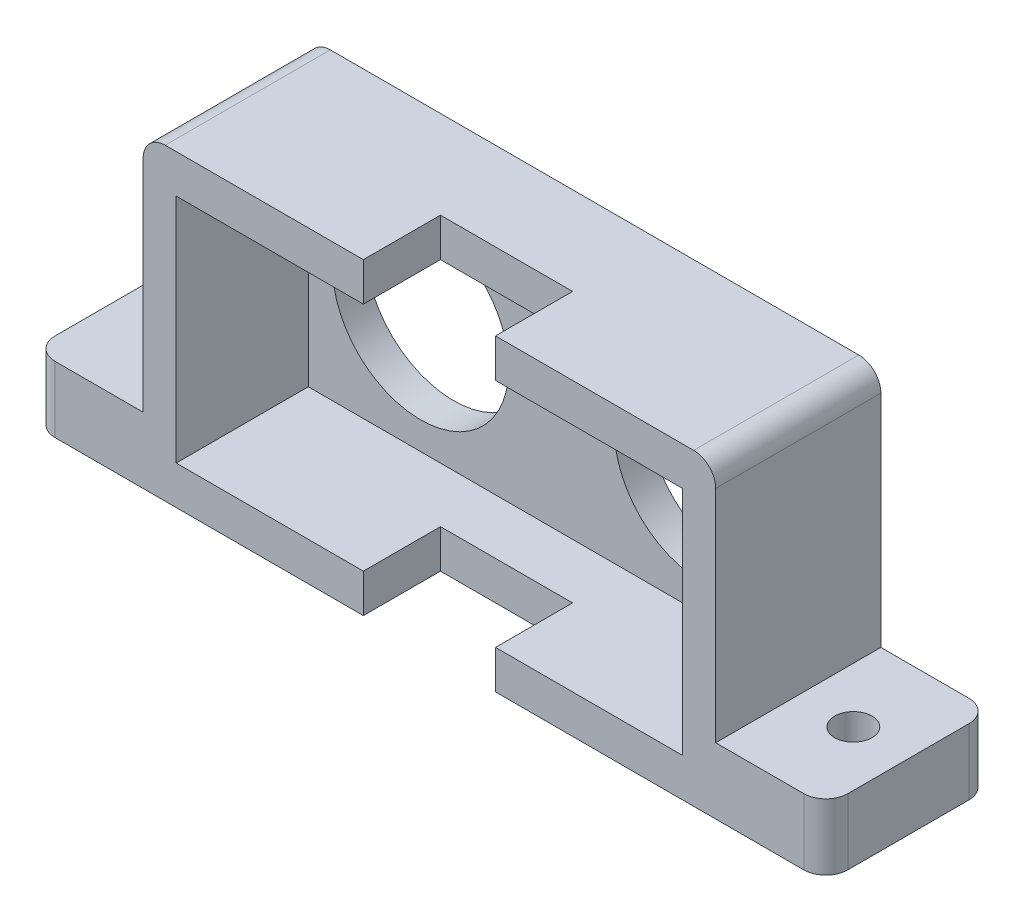
ISO-10303-21;
HEADER;
FILE_DESCRIPTION(('STEP AP214'),'2;1');
FILE_NAME('part.step','',(''),(''),'','','');
FILE_SCHEMA(('AUTOMOTIVE_DESIGN { 1 0 10303 214 1 1 1 1 }'));
ENDSEC;
DATA;
#1=APPLICATION_CONTEXT('core data for automotive mechanical design processes');
#2=APPLICATION_PROTOCOL_DEFINITION('international standard','automotive_design',2000,#1);
#3=PRODUCT_CONTEXT('',#1,'mechanical');
#4=PRODUCT('Part','Part','',(#3));
#5=PRODUCT_RELATED_PRODUCT_CATEGORY('part','',(#4));
#6=PRODUCT_DEFINITION_FORMATION('','',#4);
#7=PRODUCT_DEFINITION_CONTEXT('part definition',#1,'design');
#8=PRODUCT_DEFINITION('design','',#6,#7);
#9=PRODUCT_DEFINITION_SHAPE('','',#8);
#10=(LENGTH_UNIT() NAMED_UNIT(*) SI_UNIT(.MILLI.,.METRE.));
#11=(NAMED_UNIT(*) PLANE_ANGLE_UNIT() SI_UNIT($,.RADIAN.));
#12=(NAMED_UNIT(*) SI_UNIT($,.STERADIAN.) SOLID_ANGLE_UNIT());
#13=UNCERTAINTY_MEASURE_WITH_UNIT(LENGTH_MEASURE(1.E-05),#10,'distance_accuracy_value','');
#14=(GEOMETRIC_REPRESENTATION_CONTEXT(3) GLOBAL_UNCERTAINTY_ASSIGNED_CONTEXT((#13)) GLOBAL_UNIT_ASSIGNED_CONTEXT((#10,
#11,#12)) REPRESENTATION_CONTEXT('',''));
#15=CARTESIAN_POINT('',(0.,0.,0.));
#16=DIRECTION('',(0.,0.,1.));
#17=DIRECTION('',(1.,0.,0.));
#18=AXIS2_PLACEMENT_3D('',#15,#16,#17);
#19=CARTESIAN_POINT('',(0.,0.,15.));
#20=DIRECTION('',(0.,0.,-1.));
#21=DIRECTION('',(-1.,0.,0.));
#22=AXIS2_PLACEMENT_3D('',#19,#20,#21);
#23=PLANE('',#22);
#24=DIRECTION('',(-1.,0.,0.));
#25=VECTOR('',#24,1.);
#26=CARTESIAN_POINT('',(-36.,6.,15.));
#27=LINE('',#26,#25);
#28=CARTESIAN_POINT('',(-26.,6.,15.));
#29=VERTEX_POINT('',#28);
#30=CARTESIAN_POINT('',(-34.,6.,15.));
#31=VERTEX_POINT('',#30);
#32=EDGE_CURVE('E323',#29,#31,#27,.T.);
#33=ORIENTED_EDGE('',*,*,#32,.T.);
#34=DIRECTION('',(0.,-1.,0.));
#35=VECTOR('',#34,1.);
#36=CARTESIAN_POINT('',(-34.,0.,15.));
#37=LINE('',#36,#35);
#38=CARTESIAN_POINT('',(-34.,0.,15.));
#39=VERTEX_POINT('',#38);
#40=EDGE_CURVE('E406',#31,#39,#37,.T.);
#41=ORIENTED_EDGE('',*,*,#40,.T.);
#42=DIRECTION('',(1.,0.,0.));
#43=VECTOR('',#42,1.);
#44=CARTESIAN_POINT('',(36.,0.,15.));
#45=LINE('',#44,#43);
#46=CARTESIAN_POINT('',(-6.,0.,15.));
#47=VERTEX_POINT('',#46);
#48=EDGE_CURVE('E310',#39,#47,#45,.T.);
#49=ORIENTED_EDGE('',*,*,#48,.T.);
#50=DIRECTION('',(0.,-1.,0.));
#51=VECTOR('',#50,1.);
#52=CARTESIAN_POINT('',(-6.00000000000001,41.8924439894498,15.));
#53=LINE('',#52,#51);
#54=CARTESIAN_POINT('',(-6.,3.5,15.));
#55=VERTEX_POINT('',#54);
#56=EDGE_CURVE('E229',#55,#47,#53,.T.);
#57=ORIENTED_EDGE('',*,*,#56,.F.);
#58=DIRECTION('',(1.,0.,0.));
#59=VECTOR('',#58,1.);
#60=CARTESIAN_POINT('',(-23.,3.5,15.));
#61=LINE('',#60,#59);
#62=CARTESIAN_POINT('',(-23.,3.5,15.));
#63=VERTEX_POINT('',#62);
#64=EDGE_CURVE('E282',#63,#55,#61,.T.);
#65=ORIENTED_EDGE('',*,*,#64,.F.);
#66=DIRECTION('',(0.,-1.,0.));
#67=VECTOR('',#66,1.);
#68=CARTESIAN_POINT('',(-23.,24.5,15.));
#69=LINE('',#68,#67);
#70=CARTESIAN_POINT('',(-23.,24.5,15.));
#71=VERTEX_POINT('',#70);
#72=EDGE_CURVE('E265',#71,#63,#69,.T.);
#73=ORIENTED_EDGE('',*,*,#72,.F.);
#74=DIRECTION('',(-1.,0.,0.));
#75=VECTOR('',#74,1.);
#76=CARTESIAN_POINT('',(-23.,24.5,15.));
#77=LINE('',#76,#75);
#78=CARTESIAN_POINT('',(-6.,24.5,15.));
#79=VERTEX_POINT('',#78);
#80=EDGE_CURVE('E278',#79,#71,#77,.T.);
#81=ORIENTED_EDGE('',*,*,#80,.F.);
#82=CARTESIAN_POINT('',(-6.00000000000001,28.,15.));
#83=VERTEX_POINT('',#82);
#84=EDGE_CURVE('E241',#83,#79,#53,.T.);
#85=ORIENTED_EDGE('',*,*,#84,.F.);
#86=DIRECTION('',(-1.,0.,0.));
#87=VECTOR('',#86,1.);
#88=CARTESIAN_POINT('',(-26.,28.,15.));
#89=LINE('',#88,#87);
#90=CARTESIAN_POINT('',(-24.,28.,15.));
#91=VERTEX_POINT('',#90);
#92=EDGE_CURVE('E318',#83,#91,#89,.T.);
#93=ORIENTED_EDGE('',*,*,#92,.T.);
#94=CARTESIAN_POINT('',(-24.,26.,15.));
#95=DIRECTION('',(0.,0.,-1.));
#96=DIRECTION('',(-1.,0.,0.));
#97=AXIS2_PLACEMENT_3D('',#94,#95,#96);
#98=CIRCLE('',#97,2.);
#99=CARTESIAN_POINT('',(-26.,26.,15.));
#100=VERTEX_POINT('',#99);
#101=EDGE_CURVE('E53',#91,#100,#98,.F.);
#102=ORIENTED_EDGE('',*,*,#101,.T.);
#103=DIRECTION('',(0.,-1.,0.));
#104=VECTOR('',#103,1.);
#105=CARTESIAN_POINT('',(-26.,6.,15.));
#106=LINE('',#105,#104);
#107=EDGE_CURVE('E321',#100,#29,#106,.T.);
#108=ORIENTED_EDGE('',*,*,#107,.T.);
#109=EDGE_LOOP('',(#33,#41,#49,#57,#65,#73,#81,#85,#93,#102,#108));
#110=FACE_BOUND('',#109,.T.);
#111=ADVANCED_FACE('F38',(#110),#23,.F.);
#112=CARTESIAN_POINT('',(-36.,0.,15.));
#113=DIRECTION('',(1.,0.,0.));
#114=DIRECTION('',(0.,0.,-1.));
#115=AXIS2_PLACEMENT_3D('',#112,#113,#114);
#116=PLANE('',#115);
#117=DIRECTION('',(0.,0.,-1.));
#118=VECTOR('',#117,1.);
#119=CARTESIAN_POINT('',(-36.,6.,15.));
#120=LINE('',#119,#118);
#121=CARTESIAN_POINT('',(-36.,6.,13.));
#122=VERTEX_POINT('',#121);
#123=CARTESIAN_POINT('',(-36.,6.,2.));
#124=VERTEX_POINT('',#123);
#125=EDGE_CURVE('E326',#122,#124,#120,.T.);
#126=ORIENTED_EDGE('',*,*,#125,.T.);
#127=DIRECTION('',(0.,-1.,0.));
#128=VECTOR('',#127,1.);
#129=CARTESIAN_POINT('',(-36.,0.,2.));
#130=LINE('',#129,#128);
#131=CARTESIAN_POINT('',(-36.,0.,2.));
#132=VERTEX_POINT('',#131);
#133=EDGE_CURVE('E368',#124,#132,#130,.T.);
#134=ORIENTED_EDGE('',*,*,#133,.T.);
#135=DIRECTION('',(0.,0.,-1.));
#136=VECTOR('',#135,1.);
#137=CARTESIAN_POINT('',(-36.,0.,15.));
#138=LINE('',#137,#136);
#139=CARTESIAN_POINT('',(-36.,0.,13.));
#140=VERTEX_POINT('',#139);
#141=EDGE_CURVE('E355',#140,#132,#138,.T.);
#142=ORIENTED_EDGE('',*,*,#141,.F.);
#143=DIRECTION('',(0.,-1.,0.));
#144=VECTOR('',#143,1.);
#145=CARTESIAN_POINT('',(-36.,0.,13.));
#146=LINE('',#145,#144);
#147=EDGE_CURVE('E366',#140,#122,#146,.F.);
#148=ORIENTED_EDGE('',*,*,#147,.T.);
#149=EDGE_LOOP('',(#126,#134,#142,#148));
#150=FACE_BOUND('',#149,.T.);
#151=ADVANCED_FACE('F442',(#150),#116,.F.);
#152=CARTESIAN_POINT('',(36.,0.,15.));
#153=DIRECTION('',(0.,1.,0.));
#154=DIRECTION('',(-1.,0.,0.));
#155=AXIS2_PLACEMENT_3D('',#152,#153,#154);
#156=PLANE('',#155);
#157=CARTESIAN_POINT('',(-31.,0.,7.50000000000001));
#158=DIRECTION('',(0.,1.,0.));
#159=DIRECTION('',(0.,0.,1.));
#160=AXIS2_PLACEMENT_3D('',#157,#158,#159);
#161=CIRCLE('',#160,1.69999999999999);
#162=CARTESIAN_POINT('',(-31.,0.,9.19999999999999));
#163=VERTEX_POINT('',#162);
#164=EDGE_CURVE('E506',#163,#163,#161,.T.);
#165=ORIENTED_EDGE('',*,*,#164,.T.);
#166=EDGE_LOOP('',(#165));
#167=FACE_BOUND('',#166,.T.);
#168=CARTESIAN_POINT('',(31.,0.,7.50000000000001));
#169=DIRECTION('',(0.,1.,0.));
#170=DIRECTION('',(0.,0.,1.));
#171=AXIS2_PLACEMENT_3D('',#168,#169,#170);
#172=CIRCLE('',#171,1.69999999999999);
#173=CARTESIAN_POINT('',(31.,0.,9.2));
#174=VERTEX_POINT('',#173);
#175=EDGE_CURVE('E232',#174,#174,#172,.T.);
#176=ORIENTED_EDGE('',*,*,#175,.T.);
#177=EDGE_LOOP('',(#176));
#178=FACE_BOUND('',#177,.T.);
#179=ORIENTED_EDGE('',*,*,#141,.T.);
#180=CARTESIAN_POINT('',(-34.,0.,2.));
#181=DIRECTION('',(0.,1.,0.));
#182=DIRECTION('',(-1.,0.,0.));
#183=AXIS2_PLACEMENT_3D('',#180,#181,#182);
#184=CIRCLE('',#183,2.);
#185=CARTESIAN_POINT('',(-34.,0.,0.));
#186=VERTEX_POINT('',#185);
#187=EDGE_CURVE('E377',#132,#186,#184,.F.);
#188=ORIENTED_EDGE('',*,*,#187,.T.);
#189=DIRECTION('',(1.,0.,0.));
#190=VECTOR('',#189,1.);
#191=CARTESIAN_POINT('',(36.,0.,0.));
#192=LINE('',#191,#190);
#193=CARTESIAN_POINT('',(34.,0.,0.));
#194=VERTEX_POINT('',#193);
#195=EDGE_CURVE('E309',#186,#194,#192,.T.);
#196=ORIENTED_EDGE('',*,*,#195,.T.);
#197=CARTESIAN_POINT('',(34.,0.,2.));
#198=DIRECTION('',(0.,1.,0.));
#199=DIRECTION('',(-1.,0.,0.));
#200=AXIS2_PLACEMENT_3D('',#197,#198,#199);
#201=CIRCLE('',#200,2.);
#202=CARTESIAN_POINT('',(36.,0.,2.));
#203=VERTEX_POINT('',#202);
#204=EDGE_CURVE('E375',#194,#203,#201,.F.);
#205=ORIENTED_EDGE('',*,*,#204,.T.);
#206=DIRECTION('',(0.,0.,-1.));
#207=VECTOR('',#206,1.);
#208=CARTESIAN_POINT('',(36.,0.,15.));
#209=LINE('',#208,#207);
#210=CARTESIAN_POINT('',(36.,0.,13.));
#211=VERTEX_POINT('',#210);
#212=EDGE_CURVE('E352',#211,#203,#209,.T.);
#213=ORIENTED_EDGE('',*,*,#212,.F.);
#214=CARTESIAN_POINT('',(34.,0.,13.));
#215=DIRECTION('',(0.,1.,0.));
#216=DIRECTION('',(-1.,0.,0.));
#217=AXIS2_PLACEMENT_3D('',#214,#215,#216);
#218=CIRCLE('',#217,2.);
#219=CARTESIAN_POINT('',(34.,0.,15.));
#220=VERTEX_POINT('',#219);
#221=EDGE_CURVE('E373',#211,#220,#218,.F.);
#222=ORIENTED_EDGE('',*,*,#221,.T.);
#223=CARTESIAN_POINT('',(6.,0.,15.));
#224=VERTEX_POINT('',#223);
#225=EDGE_CURVE('E313',#224,#220,#45,.T.);
#226=ORIENTED_EDGE('',*,*,#225,.F.);
#227=DIRECTION('',(0.,0.,1.));
#228=VECTOR('',#227,1.);
#229=CARTESIAN_POINT('',(6.,0.,15.));
#230=LINE('',#229,#228);
#231=CARTESIAN_POINT('',(6.,0.,8.));
#232=VERTEX_POINT('',#231);
#233=EDGE_CURVE('E222',#232,#224,#230,.T.);
#234=ORIENTED_EDGE('',*,*,#233,.F.);
#235=DIRECTION('',(1.,0.,0.));
#236=VECTOR('',#235,1.);
#237=CARTESIAN_POINT('',(-6.,0.,8.));
#238=LINE('',#237,#236);
#239=CARTESIAN_POINT('',(-6.,0.,8.));
#240=VERTEX_POINT('',#239);
#241=EDGE_CURVE('E215',#240,#232,#238,.T.);
#242=ORIENTED_EDGE('',*,*,#241,.F.);
#243=DIRECTION('',(0.,0.,-1.));
#244=VECTOR('',#243,1.);
#245=CARTESIAN_POINT('',(-6.,0.,15.));
#246=LINE('',#245,#244);
#247=EDGE_CURVE('E226',#47,#240,#246,.T.);
#248=ORIENTED_EDGE('',*,*,#247,.F.);
#249=ORIENTED_EDGE('',*,*,#48,.F.);
#250=CARTESIAN_POINT('',(-34.,0.,13.));
#251=DIRECTION('',(0.,1.,0.));
#252=DIRECTION('',(-1.,0.,0.));
#253=AXIS2_PLACEMENT_3D('',#250,#251,#252);
#254=CIRCLE('',#253,2.);
#255=EDGE_CURVE('E371',#39,#140,#254,.F.);
#256=ORIENTED_EDGE('',*,*,#255,.T.);
#257=EDGE_LOOP('',(#179,#188,#196,#205,#213,#222,#226,#234,#242,#248,#249,#256));
#258=FACE_BOUND('',#257,.T.);
#259=ADVANCED_FACE('F235',(#167,#178,#258),#156,.F.);
#260=CARTESIAN_POINT('',(36.,6.00000000000001,15.));
#261=DIRECTION('',(-1.,0.,0.));
#262=DIRECTION('',(0.,0.,1.));
#263=AXIS2_PLACEMENT_3D('',#260,#261,#262);
#264=PLANE('',#263);
#265=ORIENTED_EDGE('',*,*,#212,.T.);
#266=DIRECTION('',(0.,1.,0.));
#267=VECTOR('',#266,1.);
#268=CARTESIAN_POINT('',(36.,6.00000000000001,2.));
#269=LINE('',#268,#267);
#270=CARTESIAN_POINT('',(36.,6.00000000000001,2.));
#271=VERTEX_POINT('',#270);
#272=EDGE_CURVE('E393',#203,#271,#269,.T.);
#273=ORIENTED_EDGE('',*,*,#272,.T.);
#274=DIRECTION('',(0.,0.,-1.));
#275=VECTOR('',#274,1.);
#276=CARTESIAN_POINT('',(36.,6.00000000000001,15.));
#277=LINE('',#276,#275);
#278=CARTESIAN_POINT('',(36.,6.00000000000001,13.));
#279=VERTEX_POINT('',#278);
#280=EDGE_CURVE('E349',#279,#271,#277,.T.);
#281=ORIENTED_EDGE('',*,*,#280,.F.);
#282=DIRECTION('',(0.,1.,0.));
#283=VECTOR('',#282,1.);
#284=CARTESIAN_POINT('',(36.,6.00000000000001,13.));
#285=LINE('',#284,#283);
#286=EDGE_CURVE('E391',#279,#211,#285,.F.);
#287=ORIENTED_EDGE('',*,*,#286,.T.);
#288=EDGE_LOOP('',(#265,#273,#281,#287));
#289=FACE_BOUND('',#288,.T.);
#290=ADVANCED_FACE('F458',(#289),#264,.F.);
#291=CARTESIAN_POINT('',(26.,6.00000000000001,15.));
#292=DIRECTION('',(0.,-1.,0.));
#293=DIRECTION('',(1.,0.,0.));
#294=AXIS2_PLACEMENT_3D('',#291,#292,#293);
#295=PLANE('',#294);
#296=CARTESIAN_POINT('',(31.,6.00000000000001,7.50000000000001));
#297=DIRECTION('',(0.,1.,0.));
#298=DIRECTION('',(0.,0.,1.));
#299=AXIS2_PLACEMENT_3D('',#296,#297,#298);
#300=CIRCLE('',#299,1.69999999999999);
#301=CARTESIAN_POINT('',(31.,6.00000000000001,9.2));
#302=VERTEX_POINT('',#301);
#303=EDGE_CURVE('E503',#302,#302,#300,.T.);
#304=ORIENTED_EDGE('',*,*,#303,.F.);
#305=EDGE_LOOP('',(#304));
#306=FACE_BOUND('',#305,.T.);
#307=ORIENTED_EDGE('',*,*,#280,.T.);
#308=CARTESIAN_POINT('',(34.,6.00000000000001,2.));
#309=DIRECTION('',(0.,-1.,0.));
#310=DIRECTION('',(1.,0.,0.));
#311=AXIS2_PLACEMENT_3D('',#308,#309,#310);
#312=CIRCLE('',#311,2.);
#313=CARTESIAN_POINT('',(34.,6.00000000000001,0.));
#314=VERTEX_POINT('',#313);
#315=EDGE_CURVE('E398',#271,#314,#312,.F.);
#316=ORIENTED_EDGE('',*,*,#315,.T.);
#317=DIRECTION('',(-1.,0.,0.));
#318=VECTOR('',#317,1.);
#319=CARTESIAN_POINT('',(26.,6.00000000000001,0.));
#320=LINE('',#319,#318);
#321=CARTESIAN_POINT('',(26.,6.00000000000001,0.));
#322=VERTEX_POINT('',#321);
#323=EDGE_CURVE('E329',#314,#322,#320,.T.);
#324=ORIENTED_EDGE('',*,*,#323,.T.);
#325=DIRECTION('',(0.,0.,-1.));
#326=VECTOR('',#325,1.);
#327=CARTESIAN_POINT('',(26.,6.00000000000001,15.));
#328=LINE('',#327,#326);
#329=CARTESIAN_POINT('',(26.,6.00000000000001,15.));
#330=VERTEX_POINT('',#329);
#331=EDGE_CURVE('E346',#330,#322,#328,.T.);
#332=ORIENTED_EDGE('',*,*,#331,.F.);
#333=DIRECTION('',(-1.,0.,0.));
#334=VECTOR('',#333,1.);
#335=CARTESIAN_POINT('',(26.,6.00000000000001,15.));
#336=LINE('',#335,#334);
#337=CARTESIAN_POINT('',(34.,6.00000000000001,15.));
#338=VERTEX_POINT('',#337);
#339=EDGE_CURVE('E312',#338,#330,#336,.T.);
#340=ORIENTED_EDGE('',*,*,#339,.F.);
#341=CARTESIAN_POINT('',(34.,6.00000000000001,13.));
#342=DIRECTION('',(0.,-1.,0.));
#343=DIRECTION('',(1.,0.,0.));
#344=AXIS2_PLACEMENT_3D('',#341,#342,#343);
#345=CIRCLE('',#344,2.);
#346=EDGE_CURVE('E396',#338,#279,#345,.F.);
#347=ORIENTED_EDGE('',*,*,#346,.T.);
#348=EDGE_LOOP('',(#307,#316,#324,#332,#340,#347));
#349=FACE_BOUND('',#348,.T.);
#350=ADVANCED_FACE('F728',(#306,#349),#295,.F.);
#351=CARTESIAN_POINT('',(26.,28.,15.));
#352=DIRECTION('',(-1.,0.,0.));
#353=DIRECTION('',(0.,-1.,0.));
#354=AXIS2_PLACEMENT_3D('',#351,#352,#353);
#355=PLANE('',#354);
#356=DIRECTION('',(0.,1.,0.));
#357=VECTOR('',#356,1.);
#358=CARTESIAN_POINT('',(26.,28.,0.));
#359=LINE('',#358,#357);
#360=CARTESIAN_POINT('',(26.,26.,0.));
#361=VERTEX_POINT('',#360);
#362=EDGE_CURVE('E331',#322,#361,#359,.T.);
#363=ORIENTED_EDGE('',*,*,#362,.T.);
#364=DIRECTION('',(0.,0.,-1.));
#365=VECTOR('',#364,1.);
#366=CARTESIAN_POINT('',(26.,26.,15.));
#367=LINE('',#366,#365);
#368=CARTESIAN_POINT('',(26.,26.,15.));
#369=VERTEX_POINT('',#368);
#370=EDGE_CURVE('E12',#361,#369,#367,.F.);
#371=ORIENTED_EDGE('',*,*,#370,.T.);
#372=DIRECTION('',(0.,1.,0.));
#373=VECTOR('',#372,1.);
#374=CARTESIAN_POINT('',(26.,28.,15.));
#375=LINE('',#374,#373);
#376=EDGE_CURVE('E315',#330,#369,#375,.T.);
#377=ORIENTED_EDGE('',*,*,#376,.F.);
#378=ORIENTED_EDGE('',*,*,#331,.T.);
#379=EDGE_LOOP('',(#363,#371,#377,#378));
#380=FACE_BOUND('',#379,.T.);
#381=ADVANCED_FACE('F735',(#380),#355,.F.);
#382=CARTESIAN_POINT('',(-26.,28.,15.));
#383=DIRECTION('',(0.,-1.,0.));
#384=DIRECTION('',(1.,0.,0.));
#385=AXIS2_PLACEMENT_3D('',#382,#383,#384);
#386=PLANE('',#385);
#387=DIRECTION('',(-1.,0.,0.));
#388=VECTOR('',#387,1.);
#389=CARTESIAN_POINT('',(-26.,28.,0.));
#390=LINE('',#389,#388);
#391=CARTESIAN_POINT('',(24.,28.,0.));
#392=VERTEX_POINT('',#391);
#393=CARTESIAN_POINT('',(-24.,28.,0.));
#394=VERTEX_POINT('',#393);
#395=EDGE_CURVE('E334',#392,#394,#390,.T.);
#396=ORIENTED_EDGE('',*,*,#395,.T.);
#397=DIRECTION('',(0.,0.,-1.));
#398=VECTOR('',#397,1.);
#399=CARTESIAN_POINT('',(-24.,28.,15.));
#400=LINE('',#399,#398);
#401=EDGE_CURVE('E46',#394,#91,#400,.F.);
#402=ORIENTED_EDGE('',*,*,#401,.T.);
#403=ORIENTED_EDGE('',*,*,#92,.F.);
#404=DIRECTION('',(0.,0.,1.));
#405=VECTOR('',#404,1.);
#406=CARTESIAN_POINT('',(-6.00000000000001,28.,15.));
#407=LINE('',#406,#405);
#408=CARTESIAN_POINT('',(-6.00000000000001,28.,8.));
#409=VERTEX_POINT('',#408);
#410=EDGE_CURVE('E254',#409,#83,#407,.T.);
#411=ORIENTED_EDGE('',*,*,#410,.F.);
#412=DIRECTION('',(-1.,0.,0.));
#413=VECTOR('',#412,1.);
#414=CARTESIAN_POINT('',(-6.00000000000001,28.,8.));
#415=LINE('',#414,#413);
#416=CARTESIAN_POINT('',(6.,28.,8.));
#417=VERTEX_POINT('',#416);
#418=EDGE_CURVE('E252',#417,#409,#415,.T.);
#419=ORIENTED_EDGE('',*,*,#418,.F.);
#420=DIRECTION('',(0.,0.,-1.));
#421=VECTOR('',#420,1.);
#422=CARTESIAN_POINT('',(5.99999999999999,28.,15.));
#423=LINE('',#422,#421);
#424=CARTESIAN_POINT('',(5.99999999999999,28.,15.));
#425=VERTEX_POINT('',#424);
#426=EDGE_CURVE('E243',#425,#417,#423,.T.);
#427=ORIENTED_EDGE('',*,*,#426,.F.);
#428=CARTESIAN_POINT('',(24.,28.,15.));
#429=VERTEX_POINT('',#428);
#430=EDGE_CURVE('E319',#429,#425,#89,.T.);
#431=ORIENTED_EDGE('',*,*,#430,.F.);
#432=DIRECTION('',(0.,0.,-1.));
#433=VECTOR('',#432,1.);
#434=CARTESIAN_POINT('',(24.,28.,15.));
#435=LINE('',#434,#433);
#436=EDGE_CURVE('E412',#429,#392,#435,.T.);
#437=ORIENTED_EDGE('',*,*,#436,.T.);
#438=EDGE_LOOP('',(#396,#402,#403,#411,#419,#427,#431,#437));
#439=FACE_BOUND('',#438,.T.);
#440=ADVANCED_FACE('F417',(#439),#386,.F.);
#441=CARTESIAN_POINT('',(-26.,6.,15.));
#442=DIRECTION('',(1.,0.,0.));
#443=DIRECTION('',(0.,0.,-1.));
#444=AXIS2_PLACEMENT_3D('',#441,#442,#443);
#445=PLANE('',#444);
#446=ORIENTED_EDGE('',*,*,#107,.F.);
#447=DIRECTION('',(0.,0.,-1.));
#448=VECTOR('',#447,1.);
#449=CARTESIAN_POINT('',(-26.,26.,15.));
#450=LINE('',#449,#448);
#451=CARTESIAN_POINT('',(-26.,26.,0.));
#452=VERTEX_POINT('',#451);
#453=EDGE_CURVE('E409',#100,#452,#450,.T.);
#454=ORIENTED_EDGE('',*,*,#453,.T.);
#455=DIRECTION('',(0.,-1.,0.));
#456=VECTOR('',#455,1.);
#457=CARTESIAN_POINT('',(-26.,6.,0.));
#458=LINE('',#457,#456);
#459=CARTESIAN_POINT('',(-26.,6.,0.));
#460=VERTEX_POINT('',#459);
#461=EDGE_CURVE('E336',#452,#460,#458,.T.);
#462=ORIENTED_EDGE('',*,*,#461,.T.);
#463=DIRECTION('',(0.,0.,-1.));
#464=VECTOR('',#463,1.);
#465=CARTESIAN_POINT('',(-26.,6.,15.));
#466=LINE('',#465,#464);
#467=EDGE_CURVE('E343',#29,#460,#466,.T.);
#468=ORIENTED_EDGE('',*,*,#467,.F.);
#469=EDGE_LOOP('',(#446,#454,#462,#468));
#470=FACE_BOUND('',#469,.T.);
#471=ADVANCED_FACE('F431',(#470),#445,.F.);
#472=CARTESIAN_POINT('',(-36.,6.,15.));
#473=DIRECTION('',(0.,-1.,0.));
#474=DIRECTION('',(0.,0.,-1.));
#475=AXIS2_PLACEMENT_3D('',#472,#473,#474);
#476=PLANE('',#475);
#477=CARTESIAN_POINT('',(-31.,6.00000000000001,7.50000000000001));
#478=DIRECTION('',(0.,1.,0.));
#479=DIRECTION('',(0.,0.,1.));
#480=AXIS2_PLACEMENT_3D('',#477,#478,#479);
#481=CIRCLE('',#480,1.69999999999999);
#482=CARTESIAN_POINT('',(-31.,6.00000000000001,9.2));
#483=VERTEX_POINT('',#482);
#484=EDGE_CURVE('E509',#483,#483,#481,.T.);
#485=ORIENTED_EDGE('',*,*,#484,.F.);
#486=EDGE_LOOP('',(#485));
#487=FACE_BOUND('',#486,.T.);
#488=DIRECTION('',(-1.,0.,0.));
#489=VECTOR('',#488,1.);
#490=CARTESIAN_POINT('',(-36.,6.,0.));
#491=LINE('',#490,#489);
#492=CARTESIAN_POINT('',(-34.,6.,0.));
#493=VERTEX_POINT('',#492);
#494=EDGE_CURVE('E338',#460,#493,#491,.T.);
#495=ORIENTED_EDGE('',*,*,#494,.T.);
#496=CARTESIAN_POINT('',(-34.,6.,2.));
#497=DIRECTION('',(0.,-1.,0.));
#498=DIRECTION('',(0.,0.,-1.));
#499=AXIS2_PLACEMENT_3D('',#496,#497,#498);
#500=CIRCLE('',#499,2.);
#501=EDGE_CURVE('E389',#493,#124,#500,.F.);
#502=ORIENTED_EDGE('',*,*,#501,.T.);
#503=ORIENTED_EDGE('',*,*,#125,.F.);
#504=CARTESIAN_POINT('',(-34.,6.,13.));
#505=DIRECTION('',(0.,-1.,0.));
#506=DIRECTION('',(0.,0.,-1.));
#507=AXIS2_PLACEMENT_3D('',#504,#505,#506);
#508=CIRCLE('',#507,2.);
#509=EDGE_CURVE('E387',#122,#31,#508,.F.);
#510=ORIENTED_EDGE('',*,*,#509,.T.);
#511=ORIENTED_EDGE('',*,*,#32,.F.);
#512=ORIENTED_EDGE('',*,*,#467,.T.);
#513=EDGE_LOOP('',(#495,#502,#503,#510,#511,#512));
#514=FACE_BOUND('',#513,.T.);
#515=ADVANCED_FACE('F515',(#487,#514),#476,.F.);
#516=ORIENTED_EDGE('',*,*,#225,.T.);
#517=DIRECTION('',(0.,1.,0.));
#518=VECTOR('',#517,1.);
#519=CARTESIAN_POINT('',(34.,0.,15.));
#520=LINE('',#519,#518);
#521=EDGE_CURVE('E402',#220,#338,#520,.T.);
#522=ORIENTED_EDGE('',*,*,#521,.T.);
#523=ORIENTED_EDGE('',*,*,#339,.T.);
#524=ORIENTED_EDGE('',*,*,#376,.T.);
#525=CARTESIAN_POINT('',(24.,26.,15.));
#526=DIRECTION('',(0.,0.,-1.));
#527=DIRECTION('',(-1.,0.,0.));
#528=AXIS2_PLACEMENT_3D('',#525,#526,#527);
#529=CIRCLE('',#528,2.);
#530=EDGE_CURVE('E400',#369,#429,#529,.F.);
#531=ORIENTED_EDGE('',*,*,#530,.T.);
#532=ORIENTED_EDGE('',*,*,#430,.T.);
#533=DIRECTION('',(0.,-1.,0.));
#534=VECTOR('',#533,1.);
#535=CARTESIAN_POINT('',(5.99999999999999,41.8924439894498,15.));
#536=LINE('',#535,#534);
#537=CARTESIAN_POINT('',(6.,24.5,15.));
#538=VERTEX_POINT('',#537);
#539=EDGE_CURVE('E244',#425,#538,#536,.T.);
#540=ORIENTED_EDGE('',*,*,#539,.T.);
#541=CARTESIAN_POINT('',(23.,24.5,15.));
#542=VERTEX_POINT('',#541);
#543=EDGE_CURVE('E274',#542,#538,#77,.T.);
#544=ORIENTED_EDGE('',*,*,#543,.F.);
#545=DIRECTION('',(0.,1.,0.));
#546=VECTOR('',#545,1.);
#547=CARTESIAN_POINT('',(23.,24.5,15.));
#548=LINE('',#547,#546);
#549=CARTESIAN_POINT('',(23.,3.5,15.));
#550=VERTEX_POINT('',#549);
#551=EDGE_CURVE('E279',#550,#542,#548,.T.);
#552=ORIENTED_EDGE('',*,*,#551,.F.);
#553=CARTESIAN_POINT('',(6.,3.5,15.));
#554=VERTEX_POINT('',#553);
#555=EDGE_CURVE('E285',#554,#550,#61,.T.);
#556=ORIENTED_EDGE('',*,*,#555,.F.);
#557=EDGE_CURVE('E247',#554,#224,#536,.T.);
#558=ORIENTED_EDGE('',*,*,#557,.T.);
#559=EDGE_LOOP('',(#516,#522,#523,#524,#531,#532,#540,#544,#552,#556,#558));
#560=FACE_BOUND('',#559,.T.);
#561=ADVANCED_FACE('F467',(#560),#23,.F.);
#562=CARTESIAN_POINT('',(0.,0.,0.));
#563=DIRECTION('',(0.,0.,-1.));
#564=DIRECTION('',(-1.,0.,0.));
#565=AXIS2_PLACEMENT_3D('',#562,#563,#564);
#566=PLANE('',#565);
#567=CARTESIAN_POINT('',(-12.8,14.,0.));
#568=DIRECTION('',(0.,0.,1.));
#569=DIRECTION('',(1.,0.,0.));
#570=AXIS2_PLACEMENT_3D('',#567,#568,#569);
#571=CIRCLE('',#570,8.);
#572=CARTESIAN_POINT('',(-4.8,14.,0.));
#573=VERTEX_POINT('',#572);
#574=EDGE_CURVE('E262',#573,#573,#571,.T.);
#575=ORIENTED_EDGE('',*,*,#574,.T.);
#576=EDGE_LOOP('',(#575));
#577=FACE_BOUND('',#576,.T.);
#578=CARTESIAN_POINT('',(12.8,14.,0.));
#579=DIRECTION('',(0.,0.,1.));
#580=DIRECTION('',(1.,0.,0.));
#581=AXIS2_PLACEMENT_3D('',#578,#579,#580);
#582=CIRCLE('',#581,8.00000000000001);
#583=CARTESIAN_POINT('',(20.8,14.,0.));
#584=VERTEX_POINT('',#583);
#585=EDGE_CURVE('E269',#584,#584,#582,.T.);
#586=ORIENTED_EDGE('',*,*,#585,.T.);
#587=EDGE_LOOP('',(#586));
#588=FACE_BOUND('',#587,.T.);
#589=ORIENTED_EDGE('',*,*,#195,.F.);
#590=DIRECTION('',(0.,-1.,0.));
#591=VECTOR('',#590,1.);
#592=CARTESIAN_POINT('',(-34.,6.,0.));
#593=LINE('',#592,#591);
#594=EDGE_CURVE('E385',#186,#493,#593,.F.);
#595=ORIENTED_EDGE('',*,*,#594,.T.);
#596=ORIENTED_EDGE('',*,*,#494,.F.);
#597=ORIENTED_EDGE('',*,*,#461,.F.);
#598=CARTESIAN_POINT('',(-24.,26.,0.));
#599=DIRECTION('',(0.,0.,-1.));
#600=DIRECTION('',(-1.,0.,0.));
#601=AXIS2_PLACEMENT_3D('',#598,#599,#600);
#602=CIRCLE('',#601,2.);
#603=EDGE_CURVE('E381',#452,#394,#602,.T.);
#604=ORIENTED_EDGE('',*,*,#603,.T.);
#605=ORIENTED_EDGE('',*,*,#395,.F.);
#606=CARTESIAN_POINT('',(24.,26.,0.));
#607=DIRECTION('',(0.,0.,-1.));
#608=DIRECTION('',(-1.,0.,0.));
#609=AXIS2_PLACEMENT_3D('',#606,#607,#608);
#610=CIRCLE('',#609,2.);
#611=EDGE_CURVE('E379',#392,#361,#610,.T.);
#612=ORIENTED_EDGE('',*,*,#611,.T.);
#613=ORIENTED_EDGE('',*,*,#362,.F.);
#614=ORIENTED_EDGE('',*,*,#323,.F.);
#615=DIRECTION('',(0.,1.,0.));
#616=VECTOR('',#615,1.);
#617=CARTESIAN_POINT('',(34.,0.,0.));
#618=LINE('',#617,#616);
#619=EDGE_CURVE('E383',#314,#194,#618,.F.);
#620=ORIENTED_EDGE('',*,*,#619,.T.);
#621=EDGE_LOOP('',(#589,#595,#596,#597,#604,#605,#612,#613,#614,#620));
#622=FACE_BOUND('',#621,.T.);
#623=ADVANCED_FACE('F423',(#577,#588,#622),#566,.T.);
#624=CARTESIAN_POINT('',(0.,0.,3.));
#625=DIRECTION('',(0.,0.,-1.));
#626=DIRECTION('',(-1.,0.,0.));
#627=AXIS2_PLACEMENT_3D('',#624,#625,#626);
#628=PLANE('',#627);
#629=CARTESIAN_POINT('',(-12.8,14.,3.));
#630=DIRECTION('',(0.,0.,1.));
#631=DIRECTION('',(1.,0.,0.));
#632=AXIS2_PLACEMENT_3D('',#629,#630,#631);
#633=CIRCLE('',#632,8.);
#634=CARTESIAN_POINT('',(-4.8,14.,3.));
#635=VERTEX_POINT('',#634);
#636=EDGE_CURVE('E266',#635,#635,#633,.T.);
#637=ORIENTED_EDGE('',*,*,#636,.F.);
#638=EDGE_LOOP('',(#637));
#639=FACE_BOUND('',#638,.T.);
#640=CARTESIAN_POINT('',(12.8,14.,3.));
#641=DIRECTION('',(0.,0.,1.));
#642=DIRECTION('',(1.,0.,0.));
#643=AXIS2_PLACEMENT_3D('',#640,#641,#642);
#644=CIRCLE('',#643,8.00000000000001);
#645=CARTESIAN_POINT('',(20.8,14.,3.));
#646=VERTEX_POINT('',#645);
#647=EDGE_CURVE('E261',#646,#646,#644,.T.);
#648=ORIENTED_EDGE('',*,*,#647,.F.);
#649=EDGE_LOOP('',(#648));
#650=FACE_BOUND('',#649,.T.);
#651=DIRECTION('',(0.,-1.,0.));
#652=VECTOR('',#651,1.);
#653=CARTESIAN_POINT('',(-23.,24.5,3.));
#654=LINE('',#653,#652);
#655=CARTESIAN_POINT('',(-23.,24.5,3.));
#656=VERTEX_POINT('',#655);
#657=CARTESIAN_POINT('',(-23.,3.5,3.));
#658=VERTEX_POINT('',#657);
#659=EDGE_CURVE('E291',#656,#658,#654,.T.);
#660=ORIENTED_EDGE('',*,*,#659,.T.);
#661=DIRECTION('',(1.,0.,0.));
#662=VECTOR('',#661,1.);
#663=CARTESIAN_POINT('',(-23.,3.5,3.));
#664=LINE('',#663,#662);
#665=CARTESIAN_POINT('',(23.,3.5,3.));
#666=VERTEX_POINT('',#665);
#667=EDGE_CURVE('E277',#658,#666,#664,.T.);
#668=ORIENTED_EDGE('',*,*,#667,.T.);
#669=DIRECTION('',(0.,1.,0.));
#670=VECTOR('',#669,1.);
#671=CARTESIAN_POINT('',(23.,24.5,3.));
#672=LINE('',#671,#670);
#673=CARTESIAN_POINT('',(23.,24.5,3.));
#674=VERTEX_POINT('',#673);
#675=EDGE_CURVE('E300',#666,#674,#672,.T.);
#676=ORIENTED_EDGE('',*,*,#675,.T.);
#677=DIRECTION('',(-1.,0.,0.));
#678=VECTOR('',#677,1.);
#679=CARTESIAN_POINT('',(-23.,24.5,3.));
#680=LINE('',#679,#678);
#681=EDGE_CURVE('E296',#674,#656,#680,.T.);
#682=ORIENTED_EDGE('',*,*,#681,.T.);
#683=EDGE_LOOP('',(#660,#668,#676,#682));
#684=FACE_BOUND('',#683,.T.);
#685=ADVANCED_FACE('F489',(#639,#650,#684),#628,.F.);
#686=CARTESIAN_POINT('',(-23.,3.5,-50.5667875190821));
#687=DIRECTION('',(0.,-1.,0.));
#688=DIRECTION('',(0.,0.,-1.));
#689=AXIS2_PLACEMENT_3D('',#686,#687,#688);
#690=PLANE('',#689);
#691=ORIENTED_EDGE('',*,*,#64,.T.);
#692=DIRECTION('',(0.,0.,-1.));
#693=VECTOR('',#692,1.);
#694=CARTESIAN_POINT('',(-5.99999999999999,3.5,-50.5667875190821));
#695=LINE('',#694,#693);
#696=CARTESIAN_POINT('',(-6.,3.5,8.));
#697=VERTEX_POINT('',#696);
#698=EDGE_CURVE('E259',#55,#697,#695,.T.);
#699=ORIENTED_EDGE('',*,*,#698,.T.);
#700=DIRECTION('',(1.,0.,0.));
#701=VECTOR('',#700,1.);
#702=CARTESIAN_POINT('',(-23.,3.5,8.));
#703=LINE('',#702,#701);
#704=CARTESIAN_POINT('',(6.,3.5,8.));
#705=VERTEX_POINT('',#704);
#706=EDGE_CURVE('E218',#697,#705,#703,.T.);
#707=ORIENTED_EDGE('',*,*,#706,.T.);
#708=DIRECTION('',(0.,0.,1.));
#709=VECTOR('',#708,1.);
#710=CARTESIAN_POINT('',(6.00000000000001,3.5,-50.5667875190821));
#711=LINE('',#710,#709);
#712=EDGE_CURVE('E256',#705,#554,#711,.T.);
#713=ORIENTED_EDGE('',*,*,#712,.T.);
#714=ORIENTED_EDGE('',*,*,#555,.T.);
#715=DIRECTION('',(0.,0.,1.));
#716=VECTOR('',#715,1.);
#717=CARTESIAN_POINT('',(23.,3.5,-50.5667875190821));
#718=LINE('',#717,#716);
#719=EDGE_CURVE('E290',#666,#550,#718,.T.);
#720=ORIENTED_EDGE('',*,*,#719,.F.);
#721=ORIENTED_EDGE('',*,*,#667,.F.);
#722=DIRECTION('',(0.,0.,1.));
#723=VECTOR('',#722,1.);
#724=CARTESIAN_POINT('',(-23.,3.5,-50.5667875190821));
#725=LINE('',#724,#723);
#726=EDGE_CURVE('E294',#658,#63,#725,.T.);
#727=ORIENTED_EDGE('',*,*,#726,.T.);
#728=EDGE_LOOP('',(#691,#699,#707,#713,#714,#720,#721,#727));
#729=FACE_BOUND('',#728,.T.);
#730=ADVANCED_FACE('F475',(#729),#690,.F.);
#731=CARTESIAN_POINT('',(23.,24.5,-50.5667875190821));
#732=DIRECTION('',(1.,0.,0.));
#733=DIRECTION('',(0.,1.,0.));
#734=AXIS2_PLACEMENT_3D('',#731,#732,#733);
#735=PLANE('',#734);
#736=ORIENTED_EDGE('',*,*,#719,.T.);
#737=ORIENTED_EDGE('',*,*,#551,.T.);
#738=DIRECTION('',(0.,0.,1.));
#739=VECTOR('',#738,1.);
#740=CARTESIAN_POINT('',(23.,24.5,-50.5667875190821));
#741=LINE('',#740,#739);
#742=EDGE_CURVE('E299',#674,#542,#741,.T.);
#743=ORIENTED_EDGE('',*,*,#742,.F.);
#744=ORIENTED_EDGE('',*,*,#675,.F.);
#745=EDGE_LOOP('',(#736,#737,#743,#744));
#746=FACE_BOUND('',#745,.T.);
#747=ADVANCED_FACE('F491',(#746),#735,.F.);
#748=CARTESIAN_POINT('',(-23.,24.5,-50.5667875190821));
#749=DIRECTION('',(0.,1.,0.));
#750=DIRECTION('',(0.,0.,1.));
#751=AXIS2_PLACEMENT_3D('',#748,#749,#750);
#752=PLANE('',#751);
#753=DIRECTION('',(-1.,0.,0.));
#754=VECTOR('',#753,1.);
#755=CARTESIAN_POINT('',(-23.,24.5,8.));
#756=LINE('',#755,#754);
#757=CARTESIAN_POINT('',(6.,24.5,8.));
#758=VERTEX_POINT('',#757);
#759=CARTESIAN_POINT('',(-6.,24.5,8.));
#760=VERTEX_POINT('',#759);
#761=EDGE_CURVE('E357',#758,#760,#756,.T.);
#762=ORIENTED_EDGE('',*,*,#761,.T.);
#763=DIRECTION('',(0.,0.,1.));
#764=VECTOR('',#763,1.);
#765=CARTESIAN_POINT('',(-6.,24.5,-50.5667875190821));
#766=LINE('',#765,#764);
#767=EDGE_CURVE('E363',#760,#79,#766,.T.);
#768=ORIENTED_EDGE('',*,*,#767,.T.);
#769=ORIENTED_EDGE('',*,*,#80,.T.);
#770=DIRECTION('',(0.,0.,1.));
#771=VECTOR('',#770,1.);
#772=CARTESIAN_POINT('',(-23.,24.5,-50.5667875190821));
#773=LINE('',#772,#771);
#774=EDGE_CURVE('E295',#656,#71,#773,.T.);
#775=ORIENTED_EDGE('',*,*,#774,.F.);
#776=ORIENTED_EDGE('',*,*,#681,.F.);
#777=ORIENTED_EDGE('',*,*,#742,.T.);
#778=ORIENTED_EDGE('',*,*,#543,.T.);
#779=DIRECTION('',(0.,0.,-1.));
#780=VECTOR('',#779,1.);
#781=CARTESIAN_POINT('',(6.,24.5,-50.5667875190821));
#782=LINE('',#781,#780);
#783=EDGE_CURVE('E360',#538,#758,#782,.T.);
#784=ORIENTED_EDGE('',*,*,#783,.T.);
#785=EDGE_LOOP('',(#762,#768,#769,#775,#776,#777,#778,#784));
#786=FACE_BOUND('',#785,.T.);
#787=ADVANCED_FACE('F486',(#786),#752,.F.);
#788=CARTESIAN_POINT('',(-23.,24.5,-50.5667875190821));
#789=DIRECTION('',(-1.,0.,0.));
#790=DIRECTION('',(0.,-1.,0.));
#791=AXIS2_PLACEMENT_3D('',#788,#789,#790);
#792=PLANE('',#791);
#793=ORIENTED_EDGE('',*,*,#774,.T.);
#794=ORIENTED_EDGE('',*,*,#72,.T.);
#795=ORIENTED_EDGE('',*,*,#726,.F.);
#796=ORIENTED_EDGE('',*,*,#659,.F.);
#797=EDGE_LOOP('',(#793,#794,#795,#796));
#798=FACE_BOUND('',#797,.T.);
#799=ADVANCED_FACE('F483',(#798),#792,.F.);
#800=CARTESIAN_POINT('',(12.8,14.,0.));
#801=DIRECTION('',(0.,0.,1.));
#802=DIRECTION('',(1.,0.,0.));
#803=AXIS2_PLACEMENT_3D('',#800,#801,#802);
#804=CYLINDRICAL_SURFACE('',#803,8.00000000000001);
#805=ORIENTED_EDGE('',*,*,#585,.F.);
#806=EDGE_LOOP('',(#805));
#807=FACE_BOUND('',#806,.T.);
#808=ORIENTED_EDGE('',*,*,#647,.T.);
#809=EDGE_LOOP('',(#808));
#810=FACE_BOUND('',#809,.T.);
#811=ADVANCED_FACE('F542',(#807,#810),#804,.F.);
#812=CARTESIAN_POINT('',(-12.8,14.,0.));
#813=DIRECTION('',(0.,0.,1.));
#814=DIRECTION('',(1.,0.,0.));
#815=AXIS2_PLACEMENT_3D('',#812,#813,#814);
#816=CYLINDRICAL_SURFACE('',#815,8.);
#817=ORIENTED_EDGE('',*,*,#574,.F.);
#818=EDGE_LOOP('',(#817));
#819=FACE_BOUND('',#818,.T.);
#820=ORIENTED_EDGE('',*,*,#636,.T.);
#821=EDGE_LOOP('',(#820));
#822=FACE_BOUND('',#821,.T.);
#823=ADVANCED_FACE('F545',(#819,#822),#816,.F.);
#824=CARTESIAN_POINT('',(-6.00000000000001,41.8924439894498,8.));
#825=DIRECTION('',(0.,0.,-1.));
#826=DIRECTION('',(-1.,0.,0.));
#827=AXIS2_PLACEMENT_3D('',#824,#825,#826);
#828=PLANE('',#827);
#829=DIRECTION('',(0.,-1.,0.));
#830=VECTOR('',#829,1.);
#831=CARTESIAN_POINT('',(5.99999999999999,41.8924439894498,8.));
#832=LINE('',#831,#830);
#833=EDGE_CURVE('E248',#417,#758,#832,.T.);
#834=ORIENTED_EDGE('',*,*,#833,.F.);
#835=ORIENTED_EDGE('',*,*,#418,.T.);
#836=DIRECTION('',(0.,-1.,0.));
#837=VECTOR('',#836,1.);
#838=CARTESIAN_POINT('',(-6.00000000000001,41.8924439894498,8.));
#839=LINE('',#838,#837);
#840=EDGE_CURVE('E221',#409,#760,#839,.T.);
#841=ORIENTED_EDGE('',*,*,#840,.T.);
#842=ORIENTED_EDGE('',*,*,#761,.F.);
#843=EDGE_LOOP('',(#834,#835,#841,#842));
#844=FACE_BOUND('',#843,.T.);
#845=ADVANCED_FACE('F553',(#844),#828,.F.);
#846=CARTESIAN_POINT('',(5.99999999999999,41.8924439894498,15.));
#847=DIRECTION('',(1.,0.,0.));
#848=DIRECTION('',(0.,1.,0.));
#849=AXIS2_PLACEMENT_3D('',#846,#847,#848);
#850=PLANE('',#849);
#851=ORIENTED_EDGE('',*,*,#539,.F.);
#852=ORIENTED_EDGE('',*,*,#426,.T.);
#853=ORIENTED_EDGE('',*,*,#833,.T.);
#854=ORIENTED_EDGE('',*,*,#783,.F.);
#855=EDGE_LOOP('',(#851,#852,#853,#854));
#856=FACE_BOUND('',#855,.T.);
#857=ADVANCED_FACE('F495',(#856),#850,.F.);
#858=CARTESIAN_POINT('',(-6.00000000000001,41.8924439894498,15.));
#859=DIRECTION('',(-1.,0.,0.));
#860=DIRECTION('',(0.,-1.,0.));
#861=AXIS2_PLACEMENT_3D('',#858,#859,#860);
#862=PLANE('',#861);
#863=ORIENTED_EDGE('',*,*,#840,.F.);
#864=ORIENTED_EDGE('',*,*,#410,.T.);
#865=ORIENTED_EDGE('',*,*,#84,.T.);
#866=ORIENTED_EDGE('',*,*,#767,.F.);
#867=EDGE_LOOP('',(#863,#864,#865,#866));
#868=FACE_BOUND('',#867,.T.);
#869=ADVANCED_FACE('F610',(#868),#862,.F.);
#870=ORIENTED_EDGE('',*,*,#56,.T.);
#871=ORIENTED_EDGE('',*,*,#247,.T.);
#872=EDGE_CURVE('E211',#697,#240,#839,.T.);
#873=ORIENTED_EDGE('',*,*,#872,.F.);
#874=ORIENTED_EDGE('',*,*,#698,.F.);
#875=EDGE_LOOP('',(#870,#871,#873,#874));
#876=FACE_BOUND('',#875,.T.);
#877=ADVANCED_FACE('F227',(#876),#862,.F.);
#878=EDGE_CURVE('E250',#705,#232,#832,.T.);
#879=ORIENTED_EDGE('',*,*,#878,.T.);
#880=ORIENTED_EDGE('',*,*,#233,.T.);
#881=ORIENTED_EDGE('',*,*,#557,.F.);
#882=ORIENTED_EDGE('',*,*,#712,.F.);
#883=EDGE_LOOP('',(#879,#880,#881,#882));
#884=FACE_BOUND('',#883,.T.);
#885=ADVANCED_FACE('F473',(#884),#850,.F.);
#886=ORIENTED_EDGE('',*,*,#872,.T.);
#887=ORIENTED_EDGE('',*,*,#241,.T.);
#888=ORIENTED_EDGE('',*,*,#878,.F.);
#889=ORIENTED_EDGE('',*,*,#706,.F.);
#890=EDGE_LOOP('',(#886,#887,#888,#889));
#891=FACE_BOUND('',#890,.T.);
#892=ADVANCED_FACE('F213',(#891),#828,.F.);
#893=CARTESIAN_POINT('',(-34.,0.,2.));
#894=DIRECTION('',(0.,1.,0.));
#895=DIRECTION('',(0.,0.,1.));
#896=AXIS2_PLACEMENT_3D('',#893,#894,#895);
#897=CYLINDRICAL_SURFACE('',#896,2.);
#898=ORIENTED_EDGE('',*,*,#501,.F.);
#899=ORIENTED_EDGE('',*,*,#594,.F.);
#900=ORIENTED_EDGE('',*,*,#187,.F.);
#901=ORIENTED_EDGE('',*,*,#133,.F.);
#902=EDGE_LOOP('',(#898,#899,#900,#901));
#903=FACE_BOUND('',#902,.T.);
#904=ADVANCED_FACE('F447',(#903),#897,.T.);
#905=CARTESIAN_POINT('',(34.,6.00000000000001,2.));
#906=DIRECTION('',(0.,-1.,0.));
#907=DIRECTION('',(0.,0.,-1.));
#908=AXIS2_PLACEMENT_3D('',#905,#906,#907);
#909=CYLINDRICAL_SURFACE('',#908,2.);
#910=ORIENTED_EDGE('',*,*,#204,.F.);
#911=ORIENTED_EDGE('',*,*,#619,.F.);
#912=ORIENTED_EDGE('',*,*,#315,.F.);
#913=ORIENTED_EDGE('',*,*,#272,.F.);
#914=EDGE_LOOP('',(#910,#911,#912,#913));
#915=FACE_BOUND('',#914,.T.);
#916=ADVANCED_FACE('F453',(#915),#909,.T.);
#917=CARTESIAN_POINT('',(34.,0.,13.));
#918=DIRECTION('',(0.,1.,0.));
#919=DIRECTION('',(0.,0.,1.));
#920=AXIS2_PLACEMENT_3D('',#917,#918,#919);
#921=CYLINDRICAL_SURFACE('',#920,2.);
#922=ORIENTED_EDGE('',*,*,#221,.F.);
#923=ORIENTED_EDGE('',*,*,#286,.F.);
#924=ORIENTED_EDGE('',*,*,#346,.F.);
#925=ORIENTED_EDGE('',*,*,#521,.F.);
#926=EDGE_LOOP('',(#922,#923,#924,#925));
#927=FACE_BOUND('',#926,.T.);
#928=ADVANCED_FACE('F462',(#927),#921,.T.);
#929=CARTESIAN_POINT('',(-34.,0.,13.));
#930=DIRECTION('',(0.,-1.,0.));
#931=DIRECTION('',(0.,0.,-1.));
#932=AXIS2_PLACEMENT_3D('',#929,#930,#931);
#933=CYLINDRICAL_SURFACE('',#932,2.);
#934=ORIENTED_EDGE('',*,*,#509,.F.);
#935=ORIENTED_EDGE('',*,*,#147,.F.);
#936=ORIENTED_EDGE('',*,*,#255,.F.);
#937=ORIENTED_EDGE('',*,*,#40,.F.);
#938=EDGE_LOOP('',(#934,#935,#936,#937));
#939=FACE_BOUND('',#938,.T.);
#940=ADVANCED_FACE('F438',(#939),#933,.T.);
#941=CARTESIAN_POINT('',(-24.,26.,15.));
#942=DIRECTION('',(0.,0.,-1.));
#943=DIRECTION('',(-1.,0.,0.));
#944=AXIS2_PLACEMENT_3D('',#941,#942,#943);
#945=CYLINDRICAL_SURFACE('',#944,2.);
#946=ORIENTED_EDGE('',*,*,#101,.F.);
#947=ORIENTED_EDGE('',*,*,#401,.F.);
#948=ORIENTED_EDGE('',*,*,#603,.F.);
#949=ORIENTED_EDGE('',*,*,#453,.F.);
#950=EDGE_LOOP('',(#946,#947,#948,#949));
#951=FACE_BOUND('',#950,.T.);
#952=ADVANCED_FACE('F429',(#951),#945,.T.);
#953=CARTESIAN_POINT('',(24.,26.,15.));
#954=DIRECTION('',(0.,0.,-1.));
#955=DIRECTION('',(-1.,0.,0.));
#956=AXIS2_PLACEMENT_3D('',#953,#954,#955);
#957=CYLINDRICAL_SURFACE('',#956,2.);
#958=ORIENTED_EDGE('',*,*,#530,.F.);
#959=ORIENTED_EDGE('',*,*,#370,.F.);
#960=ORIENTED_EDGE('',*,*,#611,.F.);
#961=ORIENTED_EDGE('',*,*,#436,.F.);
#962=EDGE_LOOP('',(#958,#959,#960,#961));
#963=FACE_BOUND('',#962,.T.);
#964=ADVANCED_FACE('F40',(#963),#957,.T.);
#965=CARTESIAN_POINT('',(31.,6.00000000000001,7.50000000000001));
#966=DIRECTION('',(0.,1.,0.));
#967=DIRECTION('',(0.,0.,1.));
#968=AXIS2_PLACEMENT_3D('',#965,#966,#967);
#969=CYLINDRICAL_SURFACE('',#968,1.69999999999999);
#970=ORIENTED_EDGE('',*,*,#175,.F.);
#971=EDGE_LOOP('',(#970));
#972=FACE_BOUND('',#971,.T.);
#973=ORIENTED_EDGE('',*,*,#303,.T.);
#974=EDGE_LOOP('',(#973));
#975=FACE_BOUND('',#974,.T.);
#976=ADVANCED_FACE('F667',(#972,#975),#969,.F.);
#977=CARTESIAN_POINT('',(-31.,6.00000000000001,7.50000000000001));
#978=DIRECTION('',(0.,1.,0.));
#979=DIRECTION('',(0.,0.,1.));
#980=AXIS2_PLACEMENT_3D('',#977,#978,#979);
#981=CYLINDRICAL_SURFACE('',#980,1.69999999999999);
#982=ORIENTED_EDGE('',*,*,#164,.F.);
#983=EDGE_LOOP('',(#982));
#984=FACE_BOUND('',#983,.T.);
#985=ORIENTED_EDGE('',*,*,#484,.T.);
#986=EDGE_LOOP('',(#985));
#987=FACE_BOUND('',#986,.T.);
#988=ADVANCED_FACE('F513',(#984,#987),#981,.F.);
#989=CLOSED_SHELL('',(#111,#151,#259,#290,#350,#381,#440,#471,#515,#561,#623,#685,#730,#747,
#787,#799,#811,#823,#845,#857,#869,#877,#885,#892,#904,#916,#928,#940,#952,#964,#976,#988));
#990=MANIFOLD_SOLID_BREP('B2',#989);
#991=ADVANCED_BREP_SHAPE_REPRESENTATION('',(#18,#990),#14);
#992=SHAPE_DEFINITION_REPRESENTATION(#9,#991);
ENDSEC;
END-ISO-10303-21;
